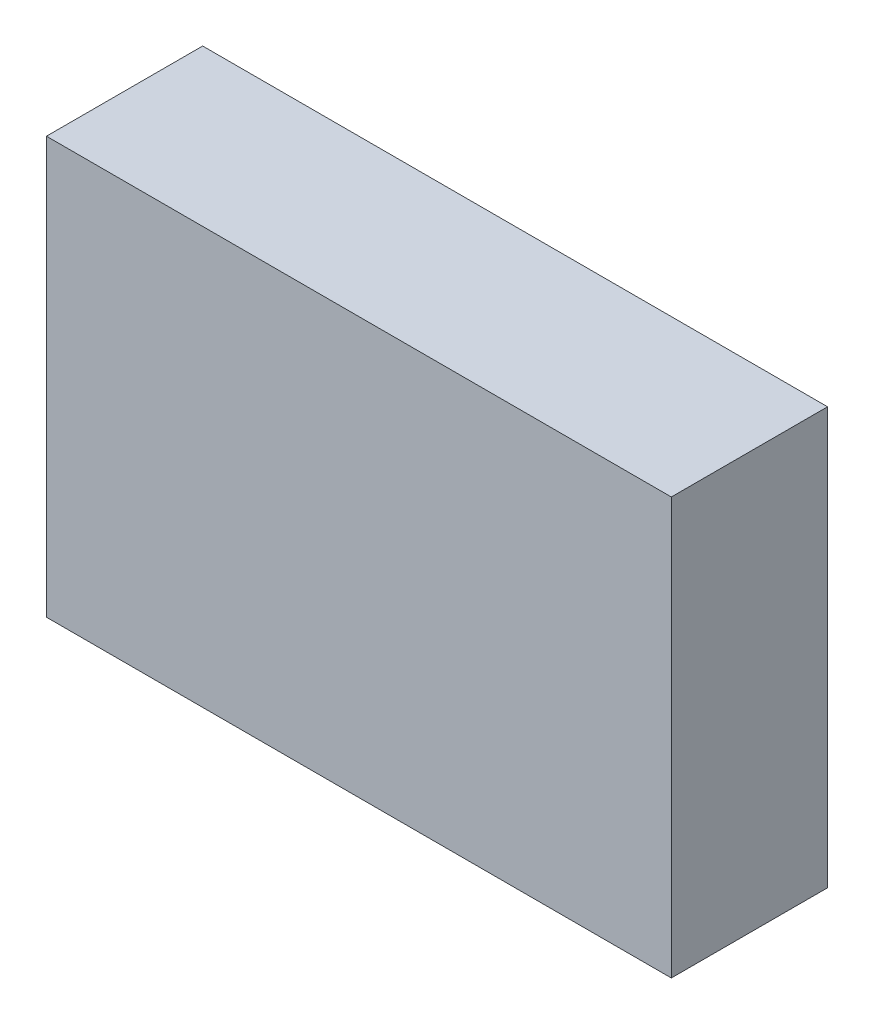
ISO-10303-21;
HEADER;
FILE_DESCRIPTION(('STEP AP214'),'2;1');
FILE_NAME('part.step','',(''),(''),'','','');
FILE_SCHEMA(('AUTOMOTIVE_DESIGN { 1 0 10303 214 1 1 1 1 }'));
ENDSEC;
DATA;
#1=APPLICATION_CONTEXT('core data for automotive mechanical design processes');
#2=APPLICATION_PROTOCOL_DEFINITION('international standard','automotive_design',2000,#1);
#3=PRODUCT_CONTEXT('',#1,'mechanical');
#4=PRODUCT('Part','Part','',(#3));
#5=PRODUCT_RELATED_PRODUCT_CATEGORY('part','',(#4));
#6=PRODUCT_DEFINITION_FORMATION('','',#4);
#7=PRODUCT_DEFINITION_CONTEXT('part definition',#1,'design');
#8=PRODUCT_DEFINITION('design','',#6,#7);
#9=PRODUCT_DEFINITION_SHAPE('','',#8);
#10=(LENGTH_UNIT() NAMED_UNIT(*) SI_UNIT(.MILLI.,.METRE.));
#11=(NAMED_UNIT(*) PLANE_ANGLE_UNIT() SI_UNIT($,.RADIAN.));
#12=(NAMED_UNIT(*) SI_UNIT($,.STERADIAN.) SOLID_ANGLE_UNIT());
#13=UNCERTAINTY_MEASURE_WITH_UNIT(LENGTH_MEASURE(1.E-05),#10,'distance_accuracy_value','');
#14=(GEOMETRIC_REPRESENTATION_CONTEXT(3) GLOBAL_UNCERTAINTY_ASSIGNED_CONTEXT((#13)) GLOBAL_UNIT_ASSIGNED_CONTEXT((#10,
#11,#12)) REPRESENTATION_CONTEXT('',''));
#15=CARTESIAN_POINT('',(0.,0.,0.));
#16=DIRECTION('',(0.,0.,1.));
#17=DIRECTION('',(1.,0.,0.));
#18=AXIS2_PLACEMENT_3D('',#15,#16,#17);
#19=CARTESIAN_POINT('',(0.,0.,15.));
#20=DIRECTION('',(-1.,0.,0.));
#21=DIRECTION('',(0.,-1.,0.));
#22=AXIS2_PLACEMENT_3D('',#19,#20,#21);
#23=PLANE('',#22);
#24=DIRECTION('',(0.,1.,0.));
#25=VECTOR('',#24,1.);
#26=CARTESIAN_POINT('',(0.,0.,0.));
#27=LINE('',#26,#25);
#28=CARTESIAN_POINT('',(0.,0.,0.));
#29=VERTEX_POINT('',#28);
#30=CARTESIAN_POINT('',(0.,40.,0.));
#31=VERTEX_POINT('',#30);
#32=EDGE_CURVE('E140',#29,#31,#27,.T.);
#33=ORIENTED_EDGE('',*,*,#32,.T.);
#34=DIRECTION('',(0.,0.,-1.));
#35=VECTOR('',#34,1.);
#36=CARTESIAN_POINT('',(0.,40.,15.));
#37=LINE('',#36,#35);
#38=CARTESIAN_POINT('',(0.,40.,15.));
#39=VERTEX_POINT('',#38);
#40=EDGE_CURVE('E11',#39,#31,#37,.T.);
#41=ORIENTED_EDGE('',*,*,#40,.F.);
#42=DIRECTION('',(0.,1.,0.));
#43=VECTOR('',#42,1.);
#44=CARTESIAN_POINT('',(0.,0.,15.));
#45=LINE('',#44,#43);
#46=CARTESIAN_POINT('',(0.,0.,15.));
#47=VERTEX_POINT('',#46);
#48=EDGE_CURVE('E144',#47,#39,#45,.T.);
#49=ORIENTED_EDGE('',*,*,#48,.F.);
#50=DIRECTION('',(0.,0.,-1.));
#51=VECTOR('',#50,1.);
#52=CARTESIAN_POINT('',(0.,0.,15.));
#53=LINE('',#52,#51);
#54=EDGE_CURVE('E150',#47,#29,#53,.T.);
#55=ORIENTED_EDGE('',*,*,#54,.T.);
#56=EDGE_LOOP('',(#33,#41,#49,#55));
#57=FACE_BOUND('',#56,.T.);
#58=ADVANCED_FACE('F33',(#57),#23,.F.);
#59=CARTESIAN_POINT('',(0.,40.,15.));
#60=DIRECTION('',(0.,-1.,0.));
#61=DIRECTION('',(1.,0.,0.));
#62=AXIS2_PLACEMENT_3D('',#59,#60,#61);
#63=PLANE('',#62);
#64=DIRECTION('',(-1.,0.,0.));
#65=VECTOR('',#64,1.);
#66=CARTESIAN_POINT('',(0.,40.,0.));
#67=LINE('',#66,#65);
#68=CARTESIAN_POINT('',(-60.,40.,0.));
#69=VERTEX_POINT('',#68);
#70=EDGE_CURVE('E153',#31,#69,#67,.T.);
#71=ORIENTED_EDGE('',*,*,#70,.T.);
#72=DIRECTION('',(0.,0.,-1.));
#73=VECTOR('',#72,1.);
#74=CARTESIAN_POINT('',(-60.,40.,15.));
#75=LINE('',#74,#73);
#76=CARTESIAN_POINT('',(-60.,40.,15.));
#77=VERTEX_POINT('',#76);
#78=EDGE_CURVE('E40',#77,#69,#75,.T.);
#79=ORIENTED_EDGE('',*,*,#78,.F.);
#80=DIRECTION('',(-1.,0.,0.));
#81=VECTOR('',#80,1.);
#82=CARTESIAN_POINT('',(0.,40.,15.));
#83=LINE('',#82,#81);
#84=EDGE_CURVE('E84',#39,#77,#83,.T.);
#85=ORIENTED_EDGE('',*,*,#84,.F.);
#86=ORIENTED_EDGE('',*,*,#40,.T.);
#87=EDGE_LOOP('',(#71,#79,#85,#86));
#88=FACE_BOUND('',#87,.T.);
#89=ADVANCED_FACE('F181',(#88),#63,.F.);
#90=CARTESIAN_POINT('',(-60.,0.,15.));
#91=DIRECTION('',(1.,0.,0.));
#92=DIRECTION('',(0.,0.,-1.));
#93=AXIS2_PLACEMENT_3D('',#90,#91,#92);
#94=PLANE('',#93);
#95=DIRECTION('',(0.,-1.,0.));
#96=VECTOR('',#95,1.);
#97=CARTESIAN_POINT('',(-60.,0.,0.));
#98=LINE('',#97,#96);
#99=CARTESIAN_POINT('',(-60.,0.,0.));
#100=VERTEX_POINT('',#99);
#101=EDGE_CURVE('E155',#69,#100,#98,.T.);
#102=ORIENTED_EDGE('',*,*,#101,.T.);
#103=DIRECTION('',(0.,0.,-1.));
#104=VECTOR('',#103,1.);
#105=CARTESIAN_POINT('',(-60.,0.,15.));
#106=LINE('',#105,#104);
#107=CARTESIAN_POINT('',(-60.,0.,15.));
#108=VERTEX_POINT('',#107);
#109=EDGE_CURVE('E159',#108,#100,#106,.T.);
#110=ORIENTED_EDGE('',*,*,#109,.F.);
#111=DIRECTION('',(0.,-1.,0.));
#112=VECTOR('',#111,1.);
#113=CARTESIAN_POINT('',(-60.,0.,15.));
#114=LINE('',#113,#112);
#115=EDGE_CURVE('E147',#77,#108,#114,.T.);
#116=ORIENTED_EDGE('',*,*,#115,.F.);
#117=ORIENTED_EDGE('',*,*,#78,.T.);
#118=EDGE_LOOP('',(#102,#110,#116,#117));
#119=FACE_BOUND('',#118,.T.);
#120=ADVANCED_FACE('F164',(#119),#94,.F.);
#121=CARTESIAN_POINT('',(0.,0.,15.));
#122=DIRECTION('',(0.,1.,0.));
#123=DIRECTION('',(0.,0.,1.));
#124=AXIS2_PLACEMENT_3D('',#121,#122,#123);
#125=PLANE('',#124);
#126=DIRECTION('',(1.,0.,0.));
#127=VECTOR('',#126,1.);
#128=CARTESIAN_POINT('',(0.,0.,0.));
#129=LINE('',#128,#127);
#130=EDGE_CURVE('E77',#100,#29,#129,.T.);
#131=ORIENTED_EDGE('',*,*,#130,.T.);
#132=ORIENTED_EDGE('',*,*,#54,.F.);
#133=DIRECTION('',(1.,0.,0.));
#134=VECTOR('',#133,1.);
#135=CARTESIAN_POINT('',(0.,0.,15.));
#136=LINE('',#135,#134);
#137=EDGE_CURVE('E56',#108,#47,#136,.T.);
#138=ORIENTED_EDGE('',*,*,#137,.F.);
#139=ORIENTED_EDGE('',*,*,#109,.T.);
#140=EDGE_LOOP('',(#131,#132,#138,#139));
#141=FACE_BOUND('',#140,.T.);
#142=ADVANCED_FACE('F172',(#141),#125,.F.);
#143=CARTESIAN_POINT('',(0.,0.,15.));
#144=DIRECTION('',(0.,0.,1.));
#145=DIRECTION('',(1.,0.,0.));
#146=AXIS2_PLACEMENT_3D('',#143,#144,#145);
#147=PLANE('',#146);
#148=ORIENTED_EDGE('',*,*,#48,.T.);
#149=ORIENTED_EDGE('',*,*,#84,.T.);
#150=ORIENTED_EDGE('',*,*,#115,.T.);
#151=ORIENTED_EDGE('',*,*,#137,.T.);
#152=EDGE_LOOP('',(#148,#149,#150,#151));
#153=FACE_BOUND('',#152,.T.);
#154=ADVANCED_FACE('F174',(#153),#147,.T.);
#155=CARTESIAN_POINT('',(0.,0.,0.));
#156=DIRECTION('',(0.,0.,1.));
#157=DIRECTION('',(1.,0.,0.));
#158=AXIS2_PLACEMENT_3D('',#155,#156,#157);
#159=PLANE('',#158);
#160=DIRECTION('',(-1.,0.,0.));
#161=VECTOR('',#160,1.);
#162=CARTESIAN_POINT('',(-2.,2.,0.));
#163=LINE('',#162,#161);
#164=CARTESIAN_POINT('',(-2.,2.,0.));
#165=VERTEX_POINT('',#164);
#166=CARTESIAN_POINT('',(-58.,2.,0.));
#167=VERTEX_POINT('',#166);
#168=EDGE_CURVE('E134',#165,#167,#163,.T.);
#169=ORIENTED_EDGE('',*,*,#168,.F.);
#170=DIRECTION('',(0.,-1.,0.));
#171=VECTOR('',#170,1.);
#172=CARTESIAN_POINT('',(-2.,38.,0.));
#173=LINE('',#172,#171);
#174=CARTESIAN_POINT('',(-2.,38.,0.));
#175=VERTEX_POINT('',#174);
#176=EDGE_CURVE('E47',#175,#165,#173,.T.);
#177=ORIENTED_EDGE('',*,*,#176,.F.);
#178=DIRECTION('',(-1.,0.,0.));
#179=VECTOR('',#178,1.);
#180=CARTESIAN_POINT('',(-2.,38.,0.));
#181=LINE('',#180,#179);
#182=CARTESIAN_POINT('',(-58.,38.,0.));
#183=VERTEX_POINT('',#182);
#184=EDGE_CURVE('E125',#175,#183,#181,.T.);
#185=ORIENTED_EDGE('',*,*,#184,.T.);
#186=DIRECTION('',(0.,-1.,0.));
#187=VECTOR('',#186,1.);
#188=CARTESIAN_POINT('',(-58.,38.,0.));
#189=LINE('',#188,#187);
#190=EDGE_CURVE('E128',#183,#167,#189,.T.);
#191=ORIENTED_EDGE('',*,*,#190,.T.);
#192=EDGE_LOOP('',(#169,#177,#185,#191));
#193=FACE_BOUND('',#192,.T.);
#194=ORIENTED_EDGE('',*,*,#32,.F.);
#195=ORIENTED_EDGE('',*,*,#130,.F.);
#196=ORIENTED_EDGE('',*,*,#101,.F.);
#197=ORIENTED_EDGE('',*,*,#70,.F.);
#198=EDGE_LOOP('',(#194,#195,#196,#197));
#199=FACE_BOUND('',#198,.T.);
#200=ADVANCED_FACE('F168',(#193,#199),#159,.F.);
#201=CARTESIAN_POINT('',(-2.,38.,13.));
#202=DIRECTION('',(1.,0.,0.));
#203=DIRECTION('',(0.,1.,0.));
#204=AXIS2_PLACEMENT_3D('',#201,#202,#203);
#205=PLANE('',#204);
#206=ORIENTED_EDGE('',*,*,#176,.T.);
#207=DIRECTION('',(0.,0.,-1.));
#208=VECTOR('',#207,1.);
#209=CARTESIAN_POINT('',(-2.,2.,13.));
#210=LINE('',#209,#208);
#211=CARTESIAN_POINT('',(-2.,2.,13.));
#212=VERTEX_POINT('',#211);
#213=EDGE_CURVE('E104',#212,#165,#210,.T.);
#214=ORIENTED_EDGE('',*,*,#213,.F.);
#215=DIRECTION('',(0.,-1.,0.));
#216=VECTOR('',#215,1.);
#217=CARTESIAN_POINT('',(-2.,38.,13.));
#218=LINE('',#217,#216);
#219=CARTESIAN_POINT('',(-2.,38.,13.));
#220=VERTEX_POINT('',#219);
#221=EDGE_CURVE('E108',#220,#212,#218,.T.);
#222=ORIENTED_EDGE('',*,*,#221,.F.);
#223=DIRECTION('',(0.,0.,-1.));
#224=VECTOR('',#223,1.);
#225=CARTESIAN_POINT('',(-2.,38.,13.));
#226=LINE('',#225,#224);
#227=EDGE_CURVE('E138',#220,#175,#226,.T.);
#228=ORIENTED_EDGE('',*,*,#227,.T.);
#229=EDGE_LOOP('',(#206,#214,#222,#228));
#230=FACE_BOUND('',#229,.T.);
#231=ADVANCED_FACE('F106',(#230),#205,.F.);
#232=CARTESIAN_POINT('',(-2.,38.,13.));
#233=DIRECTION('',(0.,-1.,0.));
#234=DIRECTION('',(0.,0.,-1.));
#235=AXIS2_PLACEMENT_3D('',#232,#233,#234);
#236=PLANE('',#235);
#237=ORIENTED_EDGE('',*,*,#184,.F.);
#238=ORIENTED_EDGE('',*,*,#227,.F.);
#239=DIRECTION('',(-1.,0.,0.));
#240=VECTOR('',#239,1.);
#241=CARTESIAN_POINT('',(-2.,38.,13.));
#242=LINE('',#241,#240);
#243=CARTESIAN_POINT('',(-58.,38.,13.));
#244=VERTEX_POINT('',#243);
#245=EDGE_CURVE('E113',#220,#244,#242,.T.);
#246=ORIENTED_EDGE('',*,*,#245,.T.);
#247=DIRECTION('',(0.,0.,-1.));
#248=VECTOR('',#247,1.);
#249=CARTESIAN_POINT('',(-58.,38.,13.));
#250=LINE('',#249,#248);
#251=EDGE_CURVE('E141',#244,#183,#250,.T.);
#252=ORIENTED_EDGE('',*,*,#251,.T.);
#253=EDGE_LOOP('',(#237,#238,#246,#252));
#254=FACE_BOUND('',#253,.T.);
#255=ADVANCED_FACE('F221',(#254),#236,.T.);
#256=CARTESIAN_POINT('',(-58.,38.,13.));
#257=DIRECTION('',(1.,0.,0.));
#258=DIRECTION('',(0.,1.,0.));
#259=AXIS2_PLACEMENT_3D('',#256,#257,#258);
#260=PLANE('',#259);
#261=ORIENTED_EDGE('',*,*,#190,.F.);
#262=ORIENTED_EDGE('',*,*,#251,.F.);
#263=DIRECTION('',(0.,-1.,0.));
#264=VECTOR('',#263,1.);
#265=CARTESIAN_POINT('',(-58.,38.,13.));
#266=LINE('',#265,#264);
#267=CARTESIAN_POINT('',(-58.,2.,13.));
#268=VERTEX_POINT('',#267);
#269=EDGE_CURVE('E121',#244,#268,#266,.T.);
#270=ORIENTED_EDGE('',*,*,#269,.T.);
#271=DIRECTION('',(0.,0.,-1.));
#272=VECTOR('',#271,1.);
#273=CARTESIAN_POINT('',(-58.,2.,13.));
#274=LINE('',#273,#272);
#275=EDGE_CURVE('E112',#268,#167,#274,.T.);
#276=ORIENTED_EDGE('',*,*,#275,.T.);
#277=EDGE_LOOP('',(#261,#262,#270,#276));
#278=FACE_BOUND('',#277,.T.);
#279=ADVANCED_FACE('F230',(#278),#260,.T.);
#280=CARTESIAN_POINT('',(-2.,2.,13.));
#281=DIRECTION('',(0.,-1.,0.));
#282=DIRECTION('',(0.,0.,-1.));
#283=AXIS2_PLACEMENT_3D('',#280,#281,#282);
#284=PLANE('',#283);
#285=ORIENTED_EDGE('',*,*,#168,.T.);
#286=ORIENTED_EDGE('',*,*,#275,.F.);
#287=DIRECTION('',(-1.,0.,0.));
#288=VECTOR('',#287,1.);
#289=CARTESIAN_POINT('',(-2.,2.,13.));
#290=LINE('',#289,#288);
#291=EDGE_CURVE('E117',#212,#268,#290,.T.);
#292=ORIENTED_EDGE('',*,*,#291,.F.);
#293=ORIENTED_EDGE('',*,*,#213,.T.);
#294=EDGE_LOOP('',(#285,#286,#292,#293));
#295=FACE_BOUND('',#294,.T.);
#296=ADVANCED_FACE('F118',(#295),#284,.F.);
#297=CARTESIAN_POINT('',(0.,0.,13.));
#298=DIRECTION('',(0.,0.,-1.));
#299=DIRECTION('',(-1.,0.,0.));
#300=AXIS2_PLACEMENT_3D('',#297,#298,#299);
#301=PLANE('',#300);
#302=ORIENTED_EDGE('',*,*,#221,.T.);
#303=ORIENTED_EDGE('',*,*,#291,.T.);
#304=ORIENTED_EDGE('',*,*,#269,.F.);
#305=ORIENTED_EDGE('',*,*,#245,.F.);
#306=EDGE_LOOP('',(#302,#303,#304,#305));
#307=FACE_BOUND('',#306,.T.);
#308=ADVANCED_FACE('F124',(#307),#301,.T.);
#309=CLOSED_SHELL('',(#58,#89,#120,#142,#154,#200,#231,#255,#279,#296,#308));
#310=MANIFOLD_SOLID_BREP('B2',#309);
#311=ADVANCED_BREP_SHAPE_REPRESENTATION('',(#18,#310),#14);
#312=SHAPE_DEFINITION_REPRESENTATION(#9,#311);
ENDSEC;
END-ISO-10303-21;
